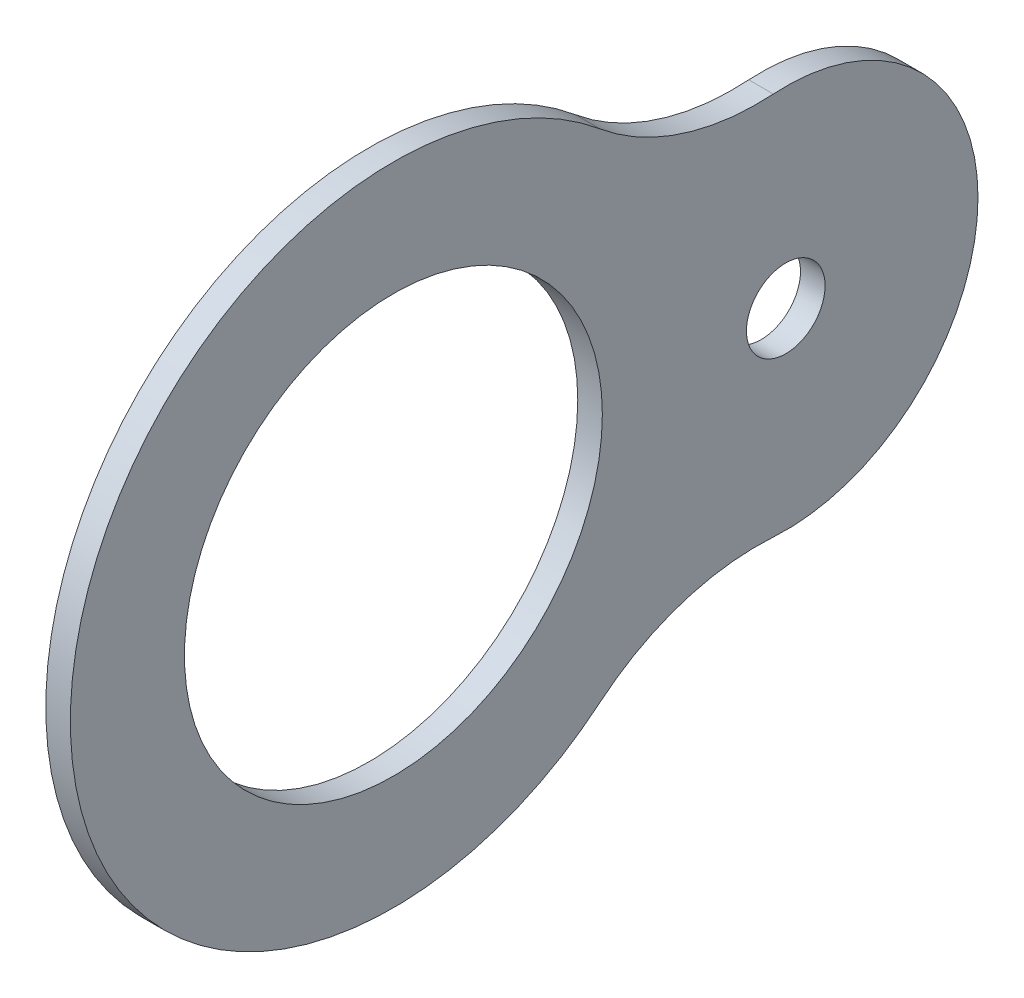
ISO-10303-21;
HEADER;
FILE_DESCRIPTION(('STEP AP214'),'2;1');
FILE_NAME('part.step','',(''),(''),'','','');
FILE_SCHEMA(('AUTOMOTIVE_DESIGN { 1 0 10303 214 1 1 1 1 }'));
ENDSEC;
DATA;
#1=APPLICATION_CONTEXT('core data for automotive mechanical design processes');
#2=APPLICATION_PROTOCOL_DEFINITION('international standard','automotive_design',2000,#1);
#3=PRODUCT_CONTEXT('',#1,'mechanical');
#4=PRODUCT('Part','Part','',(#3));
#5=PRODUCT_RELATED_PRODUCT_CATEGORY('part','',(#4));
#6=PRODUCT_DEFINITION_FORMATION('','',#4);
#7=PRODUCT_DEFINITION_CONTEXT('part definition',#1,'design');
#8=PRODUCT_DEFINITION('design','',#6,#7);
#9=PRODUCT_DEFINITION_SHAPE('','',#8);
#10=(LENGTH_UNIT() NAMED_UNIT(*) SI_UNIT(.MILLI.,.METRE.));
#11=(NAMED_UNIT(*) PLANE_ANGLE_UNIT() SI_UNIT($,.RADIAN.));
#12=(NAMED_UNIT(*) SI_UNIT($,.STERADIAN.) SOLID_ANGLE_UNIT());
#13=UNCERTAINTY_MEASURE_WITH_UNIT(LENGTH_MEASURE(1.E-05),#10,'distance_accuracy_value','');
#14=(GEOMETRIC_REPRESENTATION_CONTEXT(3) GLOBAL_UNCERTAINTY_ASSIGNED_CONTEXT((#13)) GLOBAL_UNIT_ASSIGNED_CONTEXT((#10,
#11,#12)) REPRESENTATION_CONTEXT('',''));
#15=CARTESIAN_POINT('',(0.,0.,0.));
#16=DIRECTION('',(0.,0.,1.));
#17=DIRECTION('',(1.,0.,0.));
#18=AXIS2_PLACEMENT_3D('',#15,#16,#17);
#19=CARTESIAN_POINT('',(1.,0.,-15.96));
#20=DIRECTION('',(-1.,0.,0.));
#21=DIRECTION('',(0.,0.,1.));
#22=AXIS2_PLACEMENT_3D('',#19,#20,#21);
#23=CYLINDRICAL_SURFACE('',#22,7.82);
#24=CARTESIAN_POINT('',(1.,0.,-15.96));
#25=DIRECTION('',(1.,0.,0.));
#26=DIRECTION('',(0.,0.,-1.));
#27=AXIS2_PLACEMENT_3D('',#24,#25,#26);
#28=CIRCLE('',#27,7.82);
#29=CARTESIAN_POINT('',(1.,-7.80360442846916,-15.4538795361018));
#30=VERTEX_POINT('',#29);
#31=CARTESIAN_POINT('',(1.,7.80360442846916,-15.4538795361018));
#32=VERTEX_POINT('',#31);
#33=EDGE_CURVE('E92',#30,#32,#28,.T.);
#34=ORIENTED_EDGE('',*,*,#33,.F.);
#35=DIRECTION('',(-1.,0.,0.));
#36=VECTOR('',#35,1.);
#37=CARTESIAN_POINT('',(1.,-7.80360442846916,-15.4538795361018));
#38=LINE('',#37,#36);
#39=CARTESIAN_POINT('',(0.,-7.80360442846916,-15.4538795361018));
#40=VERTEX_POINT('',#39);
#41=EDGE_CURVE('E81',#30,#40,#38,.T.);
#42=ORIENTED_EDGE('',*,*,#41,.T.);
#43=CARTESIAN_POINT('',(0.,0.,-15.96));
#44=DIRECTION('',(1.,0.,0.));
#45=DIRECTION('',(0.,0.,-1.));
#46=AXIS2_PLACEMENT_3D('',#43,#44,#45);
#47=CIRCLE('',#46,7.82);
#48=CARTESIAN_POINT('',(0.,7.80360442846916,-15.4538795361018));
#49=VERTEX_POINT('',#48);
#50=EDGE_CURVE('E90',#40,#49,#47,.T.);
#51=ORIENTED_EDGE('',*,*,#50,.T.);
#52=DIRECTION('',(-1.,0.,0.));
#53=VECTOR('',#52,1.);
#54=CARTESIAN_POINT('',(1.,7.80360442846916,-15.4538795361018));
#55=LINE('',#54,#53);
#56=EDGE_CURVE('E94',#49,#32,#55,.F.);
#57=ORIENTED_EDGE('',*,*,#56,.T.);
#58=EDGE_LOOP('',(#34,#42,#51,#57));
#59=FACE_BOUND('',#58,.T.);
#60=ADVANCED_FACE('F37',(#59),#23,.T.);
#61=CARTESIAN_POINT('',(1.,0.,0.));
#62=DIRECTION('',(-1.,0.,0.));
#63=DIRECTION('',(0.,0.,1.));
#64=AXIS2_PLACEMENT_3D('',#61,#62,#63);
#65=CYLINDRICAL_SURFACE('',#64,8.5);
#66=CARTESIAN_POINT('',(1.,0.,0.));
#67=DIRECTION('',(1.,0.,0.));
#68=DIRECTION('',(0.,0.,-1.));
#69=AXIS2_PLACEMENT_3D('',#66,#67,#68);
#70=CIRCLE('',#69,8.5);
#71=CARTESIAN_POINT('',(1.,0.,-8.5));
#72=VERTEX_POINT('',#71);
#73=EDGE_CURVE('E119',#72,#72,#70,.T.);
#74=ORIENTED_EDGE('',*,*,#73,.T.);
#75=EDGE_LOOP('',(#74));
#76=FACE_BOUND('',#75,.T.);
#77=CARTESIAN_POINT('',(0.,0.,0.));
#78=DIRECTION('',(1.,0.,0.));
#79=DIRECTION('',(0.,0.,-1.));
#80=AXIS2_PLACEMENT_3D('',#77,#78,#79);
#81=CIRCLE('',#80,8.5);
#82=CARTESIAN_POINT('',(0.,0.,-8.5));
#83=VERTEX_POINT('',#82);
#84=EDGE_CURVE('E100',#83,#83,#81,.T.);
#85=ORIENTED_EDGE('',*,*,#84,.F.);
#86=EDGE_LOOP('',(#85));
#87=FACE_BOUND('',#86,.T.);
#88=ADVANCED_FACE('F141',(#76,#87),#65,.F.);
#89=CARTESIAN_POINT('',(1.,0.,0.));
#90=DIRECTION('',(-1.,0.,0.));
#91=DIRECTION('',(0.,0.,1.));
#92=AXIS2_PLACEMENT_3D('',#89,#90,#91);
#93=CYLINDRICAL_SURFACE('',#92,13.14);
#94=CARTESIAN_POINT('',(0.,0.,0.));
#95=DIRECTION('',(1.,0.,0.));
#96=DIRECTION('',(0.,0.,-1.));
#97=AXIS2_PLACEMENT_3D('',#94,#95,#96);
#98=CIRCLE('',#97,13.14);
#99=CARTESIAN_POINT('',(0.,10.0978334602194,-8.40793431287813));
#100=VERTEX_POINT('',#99);
#101=CARTESIAN_POINT('',(0.,-10.0978334602194,-8.40793431287813));
#102=VERTEX_POINT('',#101);
#103=EDGE_CURVE('E98',#100,#102,#98,.T.);
#104=ORIENTED_EDGE('',*,*,#103,.T.);
#105=DIRECTION('',(-1.,0.,0.));
#106=VECTOR('',#105,1.);
#107=CARTESIAN_POINT('',(1.,-10.0978334602194,-8.40793431287813));
#108=LINE('',#107,#106);
#109=CARTESIAN_POINT('',(1.,-10.0978334602194,-8.40793431287813));
#110=VERTEX_POINT('',#109);
#111=EDGE_CURVE('E52',#102,#110,#108,.F.);
#112=ORIENTED_EDGE('',*,*,#111,.T.);
#113=CARTESIAN_POINT('',(1.,0.,0.));
#114=DIRECTION('',(1.,0.,0.));
#115=DIRECTION('',(0.,0.,-1.));
#116=AXIS2_PLACEMENT_3D('',#113,#114,#115);
#117=CIRCLE('',#116,13.14);
#118=CARTESIAN_POINT('',(1.,10.0978334602194,-8.40793431287813));
#119=VERTEX_POINT('',#118);
#120=EDGE_CURVE('E117',#119,#110,#117,.T.);
#121=ORIENTED_EDGE('',*,*,#120,.F.);
#122=DIRECTION('',(-1.,0.,0.));
#123=VECTOR('',#122,1.);
#124=CARTESIAN_POINT('',(1.,10.0978334602194,-8.40793431287813));
#125=LINE('',#124,#123);
#126=EDGE_CURVE('E93',#119,#100,#125,.T.);
#127=ORIENTED_EDGE('',*,*,#126,.T.);
#128=EDGE_LOOP('',(#104,#112,#121,#127));
#129=FACE_BOUND('',#128,.T.);
#130=ADVANCED_FACE('F138',(#129),#93,.T.);
#131=CARTESIAN_POINT('',(1.,0.,-15.96));
#132=DIRECTION('',(-1.,0.,0.));
#133=DIRECTION('',(0.,0.,1.));
#134=AXIS2_PLACEMENT_3D('',#131,#132,#133);
#135=CYLINDRICAL_SURFACE('',#134,1.6);
#136=CARTESIAN_POINT('',(1.,0.,-15.96));
#137=DIRECTION('',(1.,0.,0.));
#138=DIRECTION('',(0.,0.,-1.));
#139=AXIS2_PLACEMENT_3D('',#136,#137,#138);
#140=CIRCLE('',#139,1.6);
#141=CARTESIAN_POINT('',(1.,0.,-17.56));
#142=VERTEX_POINT('',#141);
#143=EDGE_CURVE('E103',#142,#142,#140,.T.);
#144=ORIENTED_EDGE('',*,*,#143,.T.);
#145=EDGE_LOOP('',(#144));
#146=FACE_BOUND('',#145,.T.);
#147=CARTESIAN_POINT('',(0.,0.,-15.96));
#148=DIRECTION('',(1.,0.,0.));
#149=DIRECTION('',(0.,0.,-1.));
#150=AXIS2_PLACEMENT_3D('',#147,#148,#149);
#151=CIRCLE('',#150,1.6);
#152=CARTESIAN_POINT('',(0.,0.,-17.56));
#153=VERTEX_POINT('',#152);
#154=EDGE_CURVE('E108',#153,#153,#151,.T.);
#155=ORIENTED_EDGE('',*,*,#154,.F.);
#156=EDGE_LOOP('',(#155));
#157=FACE_BOUND('',#156,.T.);
#158=ADVANCED_FACE('F128',(#146,#157),#135,.F.);
#159=CARTESIAN_POINT('',(1.,0.,0.));
#160=DIRECTION('',(1.,0.,0.));
#161=DIRECTION('',(0.,0.,-1.));
#162=AXIS2_PLACEMENT_3D('',#159,#160,#161);
#163=PLANE('',#162);
#164=ORIENTED_EDGE('',*,*,#120,.T.);
#165=CARTESIAN_POINT('',(1.,-17.7826382244655,-14.8066666666667));
#166=DIRECTION('',(1.,0.,0.));
#167=DIRECTION('',(0.,0.,-1.));
#168=AXIS2_PLACEMENT_3D('',#165,#166,#167);
#169=CIRCLE('',#168,10.);
#170=EDGE_CURVE('E85',#110,#30,#169,.F.);
#171=ORIENTED_EDGE('',*,*,#170,.T.);
#172=ORIENTED_EDGE('',*,*,#33,.T.);
#173=CARTESIAN_POINT('',(1.,17.7826382244655,-14.8066666666667));
#174=DIRECTION('',(1.,0.,0.));
#175=DIRECTION('',(0.,0.,-1.));
#176=AXIS2_PLACEMENT_3D('',#173,#174,#175);
#177=CIRCLE('',#176,10.);
#178=EDGE_CURVE('E11',#32,#119,#177,.F.);
#179=ORIENTED_EDGE('',*,*,#178,.T.);
#180=EDGE_LOOP('',(#164,#171,#172,#179));
#181=FACE_BOUND('',#180,.T.);
#182=ORIENTED_EDGE('',*,*,#73,.F.);
#183=EDGE_LOOP('',(#182));
#184=FACE_BOUND('',#183,.T.);
#185=ORIENTED_EDGE('',*,*,#143,.F.);
#186=EDGE_LOOP('',(#185));
#187=FACE_BOUND('',#186,.T.);
#188=ADVANCED_FACE('F115',(#181,#184,#187),#163,.T.);
#189=CARTESIAN_POINT('',(0.,0.,0.));
#190=DIRECTION('',(1.,0.,0.));
#191=DIRECTION('',(0.,0.,-1.));
#192=AXIS2_PLACEMENT_3D('',#189,#190,#191);
#193=PLANE('',#192);
#194=ORIENTED_EDGE('',*,*,#50,.F.);
#195=CARTESIAN_POINT('',(0.,-17.7826382244655,-14.8066666666667));
#196=DIRECTION('',(1.,0.,0.));
#197=DIRECTION('',(0.,0.,-1.));
#198=AXIS2_PLACEMENT_3D('',#195,#196,#197);
#199=CIRCLE('',#198,10.);
#200=EDGE_CURVE('E77',#40,#102,#199,.T.);
#201=ORIENTED_EDGE('',*,*,#200,.T.);
#202=ORIENTED_EDGE('',*,*,#103,.F.);
#203=CARTESIAN_POINT('',(0.,17.7826382244655,-14.8066666666667));
#204=DIRECTION('',(1.,0.,0.));
#205=DIRECTION('',(0.,0.,-1.));
#206=AXIS2_PLACEMENT_3D('',#203,#204,#205);
#207=CIRCLE('',#206,10.);
#208=EDGE_CURVE('E45',#100,#49,#207,.T.);
#209=ORIENTED_EDGE('',*,*,#208,.T.);
#210=EDGE_LOOP('',(#194,#201,#202,#209));
#211=FACE_BOUND('',#210,.T.);
#212=ORIENTED_EDGE('',*,*,#84,.T.);
#213=EDGE_LOOP('',(#212));
#214=FACE_BOUND('',#213,.T.);
#215=ORIENTED_EDGE('',*,*,#154,.T.);
#216=EDGE_LOOP('',(#215));
#217=FACE_BOUND('',#216,.T.);
#218=ADVANCED_FACE('F96',(#211,#214,#217),#193,.F.);
#219=CARTESIAN_POINT('',(1.,-17.7826382244655,-14.8066666666667));
#220=DIRECTION('',(1.,0.,0.));
#221=DIRECTION('',(0.,0.,-1.));
#222=AXIS2_PLACEMENT_3D('',#219,#220,#221);
#223=CYLINDRICAL_SURFACE('',#222,10.);
#224=ORIENTED_EDGE('',*,*,#170,.F.);
#225=ORIENTED_EDGE('',*,*,#111,.F.);
#226=ORIENTED_EDGE('',*,*,#200,.F.);
#227=ORIENTED_EDGE('',*,*,#41,.F.);
#228=EDGE_LOOP('',(#224,#225,#226,#227));
#229=FACE_BOUND('',#228,.T.);
#230=ADVANCED_FACE('F80',(#229),#223,.F.);
#231=CARTESIAN_POINT('',(1.,17.7826382244655,-14.8066666666667));
#232=DIRECTION('',(1.,0.,0.));
#233=DIRECTION('',(0.,0.,-1.));
#234=AXIS2_PLACEMENT_3D('',#231,#232,#233);
#235=CYLINDRICAL_SURFACE('',#234,10.);
#236=ORIENTED_EDGE('',*,*,#178,.F.);
#237=ORIENTED_EDGE('',*,*,#56,.F.);
#238=ORIENTED_EDGE('',*,*,#208,.F.);
#239=ORIENTED_EDGE('',*,*,#126,.F.);
#240=EDGE_LOOP('',(#236,#237,#238,#239));
#241=FACE_BOUND('',#240,.T.);
#242=ADVANCED_FACE('F39',(#241),#235,.F.);
#243=CLOSED_SHELL('',(#60,#88,#130,#158,#188,#218,#230,#242));
#244=MANIFOLD_SOLID_BREP('B2',#243);
#245=ADVANCED_BREP_SHAPE_REPRESENTATION('',(#18,#244),#14);
#246=SHAPE_DEFINITION_REPRESENTATION(#9,#245);
ENDSEC;
END-ISO-10303-21;
